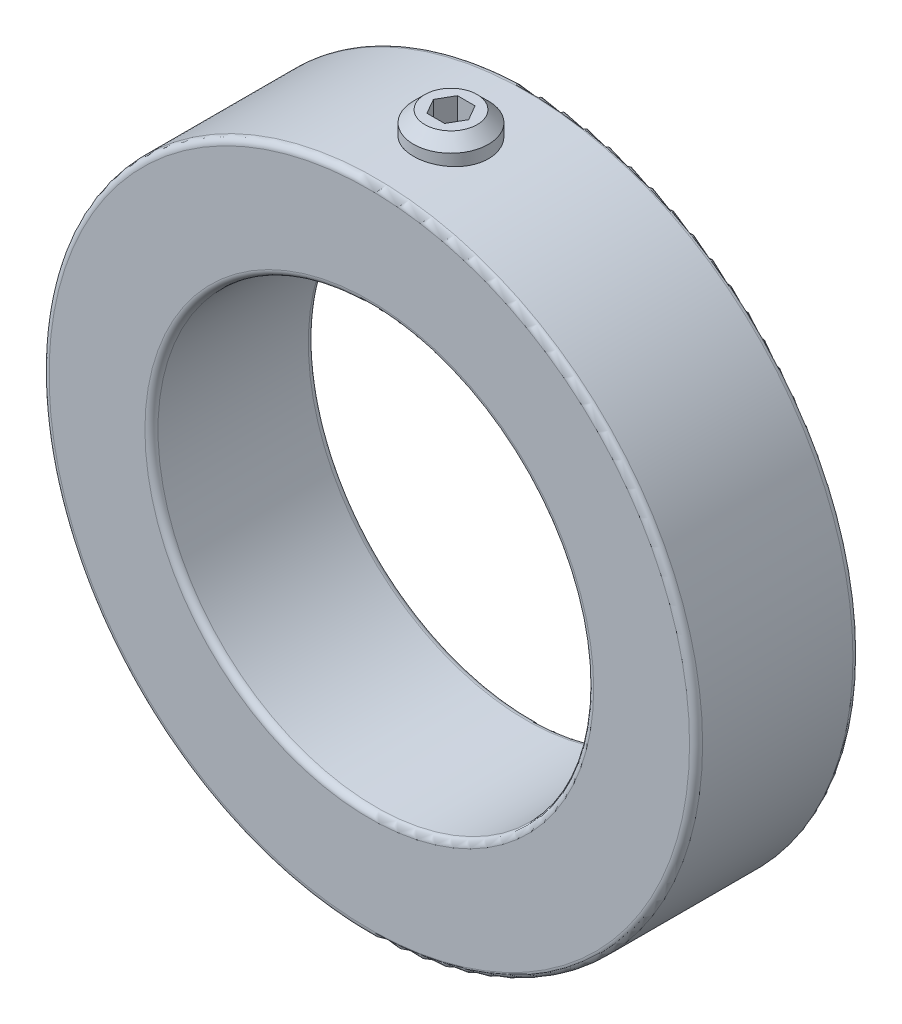
ISO-10303-21;
HEADER;
FILE_DESCRIPTION(('STEP AP214'),'2;1');
FILE_NAME('part.step','',(''),(''),'','','');
FILE_SCHEMA(('AUTOMOTIVE_DESIGN { 1 0 10303 214 1 1 1 1 }'));
ENDSEC;
DATA;
#1=APPLICATION_CONTEXT('core data for automotive mechanical design processes');
#2=APPLICATION_PROTOCOL_DEFINITION('international standard','automotive_design',2000,#1);
#3=PRODUCT_CONTEXT('',#1,'mechanical');
#4=PRODUCT('Part','Part','',(#3));
#5=PRODUCT_RELATED_PRODUCT_CATEGORY('part','',(#4));
#6=PRODUCT_DEFINITION_FORMATION('','',#4);
#7=PRODUCT_DEFINITION_CONTEXT('part definition',#1,'design');
#8=PRODUCT_DEFINITION('design','',#6,#7);
#9=PRODUCT_DEFINITION_SHAPE('','',#8);
#10=(LENGTH_UNIT() NAMED_UNIT(*) SI_UNIT(.MILLI.,.METRE.));
#11=(NAMED_UNIT(*) PLANE_ANGLE_UNIT() SI_UNIT($,.RADIAN.));
#12=(NAMED_UNIT(*) SI_UNIT($,.STERADIAN.) SOLID_ANGLE_UNIT());
#13=UNCERTAINTY_MEASURE_WITH_UNIT(LENGTH_MEASURE(1.E-05),#10,'distance_accuracy_value','');
#14=(GEOMETRIC_REPRESENTATION_CONTEXT(3) GLOBAL_UNCERTAINTY_ASSIGNED_CONTEXT((#13)) GLOBAL_UNIT_ASSIGNED_CONTEXT((#10,
#11,#12)) REPRESENTATION_CONTEXT('',''));
#15=CARTESIAN_POINT('',(0.,0.,0.));
#16=DIRECTION('',(0.,0.,1.));
#17=DIRECTION('',(1.,0.,0.));
#18=AXIS2_PLACEMENT_3D('',#15,#16,#17);
#19=CARTESIAN_POINT('',(0.,10.16,0.));
#20=DIRECTION('',(0.,1.,0.));
#21=DIRECTION('',(-1.,0.,0.));
#22=AXIS2_PLACEMENT_3D('',#19,#20,#21);
#23=PLANE('',#22);
#24=CARTESIAN_POINT('',(0.,10.16,0.));
#25=DIRECTION('',(0.,1.,0.));
#26=DIRECTION('',(-1.,0.,0.));
#27=AXIS2_PLACEMENT_3D('',#24,#25,#26);
#28=CIRCLE('',#27,0.761379651034046);
#29=CARTESIAN_POINT('',(-0.761379651034046,10.16,0.));
#30=VERTEX_POINT('',#29);
#31=EDGE_CURVE('E12',#30,#30,#28,.T.);
#32=ORIENTED_EDGE('',*,*,#31,.T.);
#33=EDGE_LOOP('',(#32));
#34=FACE_BOUND('',#33,.T.);
#35=DIRECTION('',(1.,0.,0.));
#36=VECTOR('',#35,1.);
#37=CARTESIAN_POINT('',(-0.256632194654789,10.16,-0.444499999999997));
#38=LINE('',#37,#36);
#39=CARTESIAN_POINT('',(-0.256632194654789,10.16,-0.444499999999997));
#40=VERTEX_POINT('',#39);
#41=CARTESIAN_POINT('',(0.256632194654789,10.16,-0.444499999999997));
#42=VERTEX_POINT('',#41);
#43=EDGE_CURVE('E115',#40,#42,#38,.T.);
#44=ORIENTED_EDGE('',*,*,#43,.T.);
#45=DIRECTION('',(0.5,0.,0.866025403784439));
#46=VECTOR('',#45,1.);
#47=CARTESIAN_POINT('',(0.256632194654789,10.16,-0.444499999999997));
#48=LINE('',#47,#46);
#49=CARTESIAN_POINT('',(0.513264389309577,10.16,0.));
#50=VERTEX_POINT('',#49);
#51=EDGE_CURVE('E61',#42,#50,#48,.T.);
#52=ORIENTED_EDGE('',*,*,#51,.T.);
#53=DIRECTION('',(-0.5,0.,0.866025403784439));
#54=VECTOR('',#53,1.);
#55=CARTESIAN_POINT('',(0.513264389309577,10.16,0.));
#56=LINE('',#55,#54);
#57=CARTESIAN_POINT('',(0.256632194654789,10.16,0.444500000000003));
#58=VERTEX_POINT('',#57);
#59=EDGE_CURVE('E119',#50,#58,#56,.T.);
#60=ORIENTED_EDGE('',*,*,#59,.T.);
#61=DIRECTION('',(-1.,0.,0.));
#62=VECTOR('',#61,1.);
#63=CARTESIAN_POINT('',(0.256632194654789,10.16,0.444500000000003));
#64=LINE('',#63,#62);
#65=CARTESIAN_POINT('',(-0.256632194654789,10.16,0.444500000000003));
#66=VERTEX_POINT('',#65);
#67=EDGE_CURVE('E182',#58,#66,#64,.T.);
#68=ORIENTED_EDGE('',*,*,#67,.T.);
#69=DIRECTION('',(-0.5,0.,-0.866025403784439));
#70=VECTOR('',#69,1.);
#71=CARTESIAN_POINT('',(-0.256632194654789,10.16,0.444500000000003));
#72=LINE('',#71,#70);
#73=CARTESIAN_POINT('',(-0.513264389309578,10.16,0.));
#74=VERTEX_POINT('',#73);
#75=EDGE_CURVE('E167',#66,#74,#72,.T.);
#76=ORIENTED_EDGE('',*,*,#75,.T.);
#77=DIRECTION('',(0.5,0.,-0.866025403784439));
#78=VECTOR('',#77,1.);
#79=CARTESIAN_POINT('',(-0.513264389309578,10.16,0.));
#80=LINE('',#79,#78);
#81=EDGE_CURVE('E163',#74,#40,#80,.T.);
#82=ORIENTED_EDGE('',*,*,#81,.T.);
#83=EDGE_LOOP('',(#44,#52,#60,#68,#76,#82));
#84=FACE_BOUND('',#83,.T.);
#85=ADVANCED_FACE('F47',(#34,#84),#23,.T.);
#86=CARTESIAN_POINT('',(0.,10.16,0.));
#87=DIRECTION('',(0.,-1.,0.));
#88=DIRECTION('',(1.,0.,0.));
#89=AXIS2_PLACEMENT_3D('',#86,#87,#88);
#90=CONICAL_SURFACE('',#89,0.761379651034046,0.785398163397447);
#91=CARTESIAN_POINT('',(0.,9.82917965103404,0.));
#92=DIRECTION('',(0.,1.,0.));
#93=DIRECTION('',(-1.,0.,0.));
#94=AXIS2_PLACEMENT_3D('',#91,#92,#93);
#95=CIRCLE('',#94,1.0922);
#96=CARTESIAN_POINT('',(-1.0922,9.82917965103404,0.));
#97=VERTEX_POINT('',#96);
#98=EDGE_CURVE('E54',#97,#97,#95,.T.);
#99=ORIENTED_EDGE('',*,*,#98,.T.);
#100=EDGE_LOOP('',(#99));
#101=FACE_BOUND('',#100,.T.);
#102=ORIENTED_EDGE('',*,*,#31,.F.);
#103=EDGE_LOOP('',(#102));
#104=FACE_BOUND('',#103,.T.);
#105=ADVANCED_FACE('F137',(#101,#104),#90,.T.);
#106=CARTESIAN_POINT('',(0.,6.35,0.));
#107=DIRECTION('',(0.,1.,0.));
#108=DIRECTION('',(-1.,0.,0.));
#109=AXIS2_PLACEMENT_3D('',#106,#107,#108);
#110=CYLINDRICAL_SURFACE('',#109,1.0922);
#111=CARTESIAN_POINT('',(0.,6.68082034896596,0.));
#112=DIRECTION('',(0.,1.,0.));
#113=DIRECTION('',(-1.,0.,0.));
#114=AXIS2_PLACEMENT_3D('',#111,#112,#113);
#115=CIRCLE('',#114,1.0922);
#116=CARTESIAN_POINT('',(-1.0922,6.68082034896596,0.));
#117=VERTEX_POINT('',#116);
#118=EDGE_CURVE('E132',#117,#117,#115,.T.);
#119=ORIENTED_EDGE('',*,*,#118,.T.);
#120=EDGE_LOOP('',(#119));
#121=FACE_BOUND('',#120,.T.);
#122=ORIENTED_EDGE('',*,*,#98,.F.);
#123=EDGE_LOOP('',(#122));
#124=FACE_BOUND('',#123,.T.);
#125=ADVANCED_FACE('F140',(#121,#124),#110,.T.);
#126=CARTESIAN_POINT('',(0.,6.68082034896596,0.));
#127=DIRECTION('',(0.,1.,0.));
#128=DIRECTION('',(-1.,0.,0.));
#129=AXIS2_PLACEMENT_3D('',#126,#127,#128);
#130=CONICAL_SURFACE('',#129,1.0922,0.785398163397448);
#131=CARTESIAN_POINT('',(0.,6.35,0.));
#132=DIRECTION('',(0.,1.,0.));
#133=DIRECTION('',(-1.,0.,0.));
#134=AXIS2_PLACEMENT_3D('',#131,#132,#133);
#135=CIRCLE('',#134,0.761379651034046);
#136=CARTESIAN_POINT('',(-0.761379651034046,6.35,0.));
#137=VERTEX_POINT('',#136);
#138=EDGE_CURVE('E124',#137,#137,#135,.T.);
#139=ORIENTED_EDGE('',*,*,#138,.T.);
#140=EDGE_LOOP('',(#139));
#141=FACE_BOUND('',#140,.T.);
#142=ORIENTED_EDGE('',*,*,#118,.F.);
#143=EDGE_LOOP('',(#142));
#144=FACE_BOUND('',#143,.T.);
#145=ADVANCED_FACE('F142',(#141,#144),#130,.T.);
#146=CARTESIAN_POINT('',(-0.761379651034046,6.35,0.));
#147=DIRECTION('',(0.,-1.,0.));
#148=DIRECTION('',(1.,0.,0.));
#149=AXIS2_PLACEMENT_3D('',#146,#147,#148);
#150=PLANE('',#149);
#151=CARTESIAN_POINT('',(0.,6.35,0.));
#152=DIRECTION('',(0.,1.,0.));
#153=DIRECTION('',(-1.,0.,0.));
#154=AXIS2_PLACEMENT_3D('',#151,#152,#153);
#155=CIRCLE('',#154,0.396984418759147);
#156=CARTESIAN_POINT('',(-0.396984418759147,6.35,0.));
#157=VERTEX_POINT('',#156);
#158=EDGE_CURVE('E120',#157,#157,#155,.T.);
#159=ORIENTED_EDGE('',*,*,#158,.T.);
#160=EDGE_LOOP('',(#159));
#161=FACE_BOUND('',#160,.T.);
#162=ORIENTED_EDGE('',*,*,#138,.F.);
#163=EDGE_LOOP('',(#162));
#164=FACE_BOUND('',#163,.T.);
#165=ADVANCED_FACE('F149',(#161,#164),#150,.T.);
#166=CARTESIAN_POINT('',(0.,6.35,0.));
#167=DIRECTION('',(0.,-1.,0.));
#168=DIRECTION('',(1.,0.,0.));
#169=AXIS2_PLACEMENT_3D('',#166,#167,#168);
#170=CONICAL_SURFACE('',#169,0.396984418759147,0.785398163397448);
#171=CARTESIAN_POINT('',(0.,6.74698441875915,0.));
#172=VERTEX_POINT('',#171);
#173=VERTEX_LOOP('',#172);
#174=FACE_BOUND('',#173,.T.);
#175=ORIENTED_EDGE('',*,*,#158,.F.);
#176=EDGE_LOOP('',(#175));
#177=FACE_BOUND('',#176,.T.);
#178=ADVANCED_FACE('F216',(#174,#177),#170,.F.);
#179=CARTESIAN_POINT('',(0.256632194654789,9.27099999999999,-0.444499999999997));
#180=DIRECTION('',(-0.866025403784439,0.,0.5));
#181=DIRECTION('',(0.5,0.,0.866025403784439));
#182=AXIS2_PLACEMENT_3D('',#179,#180,#181);
#183=PLANE('',#182);
#184=ORIENTED_EDGE('',*,*,#51,.F.);
#185=DIRECTION('',(0.,1.,0.));
#186=VECTOR('',#185,1.);
#187=CARTESIAN_POINT('',(0.256632194654789,9.27099999999999,-0.444499999999997));
#188=LINE('',#187,#186);
#189=CARTESIAN_POINT('',(0.256632194654789,9.27099999999999,-0.444499999999997));
#190=VERTEX_POINT('',#189);
#191=EDGE_CURVE('E114',#190,#42,#188,.T.);
#192=ORIENTED_EDGE('',*,*,#191,.F.);
#193=DIRECTION('',(0.5,0.,0.866025403784439));
#194=VECTOR('',#193,1.);
#195=CARTESIAN_POINT('',(0.256632194654789,9.27099999999999,-0.444499999999997));
#196=LINE('',#195,#194);
#197=CARTESIAN_POINT('',(0.513264389309577,9.27099999999999,0.));
#198=VERTEX_POINT('',#197);
#199=EDGE_CURVE('E105',#190,#198,#196,.T.);
#200=ORIENTED_EDGE('',*,*,#199,.T.);
#201=DIRECTION('',(0.,1.,0.));
#202=VECTOR('',#201,1.);
#203=CARTESIAN_POINT('',(0.513264389309577,9.27099999999999,0.));
#204=LINE('',#203,#202);
#205=EDGE_CURVE('E113',#198,#50,#204,.T.);
#206=ORIENTED_EDGE('',*,*,#205,.T.);
#207=EDGE_LOOP('',(#184,#192,#200,#206));
#208=FACE_BOUND('',#207,.T.);
#209=ADVANCED_FACE('F112',(#208),#183,.T.);
#210=CARTESIAN_POINT('',(0.513264389309577,9.27099999999999,0.));
#211=DIRECTION('',(-0.866025403784439,0.,-0.5));
#212=DIRECTION('',(-0.5,0.,0.866025403784439));
#213=AXIS2_PLACEMENT_3D('',#210,#211,#212);
#214=PLANE('',#213);
#215=ORIENTED_EDGE('',*,*,#59,.F.);
#216=ORIENTED_EDGE('',*,*,#205,.F.);
#217=DIRECTION('',(-0.5,0.,0.866025403784439));
#218=VECTOR('',#217,1.);
#219=CARTESIAN_POINT('',(0.513264389309577,9.27099999999999,0.));
#220=LINE('',#219,#218);
#221=CARTESIAN_POINT('',(0.256632194654789,9.27099999999999,0.444500000000003));
#222=VERTEX_POINT('',#221);
#223=EDGE_CURVE('E101',#198,#222,#220,.T.);
#224=ORIENTED_EDGE('',*,*,#223,.T.);
#225=DIRECTION('',(0.,1.,0.));
#226=VECTOR('',#225,1.);
#227=CARTESIAN_POINT('',(0.256632194654789,9.27099999999999,0.444500000000003));
#228=LINE('',#227,#226);
#229=EDGE_CURVE('E121',#222,#58,#228,.T.);
#230=ORIENTED_EDGE('',*,*,#229,.T.);
#231=EDGE_LOOP('',(#215,#216,#224,#230));
#232=FACE_BOUND('',#231,.T.);
#233=ADVANCED_FACE('F117',(#232),#214,.T.);
#234=CARTESIAN_POINT('',(0.256632194654789,9.27099999999999,0.444500000000003));
#235=DIRECTION('',(0.,0.,-1.));
#236=DIRECTION('',(-1.,0.,0.));
#237=AXIS2_PLACEMENT_3D('',#234,#235,#236);
#238=PLANE('',#237);
#239=ORIENTED_EDGE('',*,*,#67,.F.);
#240=ORIENTED_EDGE('',*,*,#229,.F.);
#241=DIRECTION('',(-1.,0.,0.));
#242=VECTOR('',#241,1.);
#243=CARTESIAN_POINT('',(0.256632194654789,9.27099999999999,0.444500000000003));
#244=LINE('',#243,#242);
#245=CARTESIAN_POINT('',(-0.256632194654789,9.27099999999999,0.444500000000003));
#246=VERTEX_POINT('',#245);
#247=EDGE_CURVE('E107',#222,#246,#244,.T.);
#248=ORIENTED_EDGE('',*,*,#247,.T.);
#249=DIRECTION('',(0.,1.,0.));
#250=VECTOR('',#249,1.);
#251=CARTESIAN_POINT('',(-0.256632194654789,9.27099999999999,0.444500000000003));
#252=LINE('',#251,#250);
#253=EDGE_CURVE('E126',#246,#66,#252,.T.);
#254=ORIENTED_EDGE('',*,*,#253,.T.);
#255=EDGE_LOOP('',(#239,#240,#248,#254));
#256=FACE_BOUND('',#255,.T.);
#257=ADVANCED_FACE('F180',(#256),#238,.T.);
#258=CARTESIAN_POINT('',(-0.256632194654789,9.27099999999999,0.444500000000003));
#259=DIRECTION('',(0.866025403784438,0.,-0.5));
#260=DIRECTION('',(-0.5,0.,-0.866025403784438));
#261=AXIS2_PLACEMENT_3D('',#258,#259,#260);
#262=PLANE('',#261);
#263=ORIENTED_EDGE('',*,*,#75,.F.);
#264=ORIENTED_EDGE('',*,*,#253,.F.);
#265=DIRECTION('',(-0.5,0.,-0.866025403784439));
#266=VECTOR('',#265,1.);
#267=CARTESIAN_POINT('',(-0.256632194654789,9.27099999999999,0.444500000000003));
#268=LINE('',#267,#266);
#269=CARTESIAN_POINT('',(-0.513264389309578,9.27099999999999,0.));
#270=VERTEX_POINT('',#269);
#271=EDGE_CURVE('E193',#246,#270,#268,.T.);
#272=ORIENTED_EDGE('',*,*,#271,.T.);
#273=DIRECTION('',(0.,1.,0.));
#274=VECTOR('',#273,1.);
#275=CARTESIAN_POINT('',(-0.513264389309578,9.27099999999999,0.));
#276=LINE('',#275,#274);
#277=EDGE_CURVE('E175',#270,#74,#276,.T.);
#278=ORIENTED_EDGE('',*,*,#277,.T.);
#279=EDGE_LOOP('',(#263,#264,#272,#278));
#280=FACE_BOUND('',#279,.T.);
#281=ADVANCED_FACE('F184',(#280),#262,.T.);
#282=CARTESIAN_POINT('',(-0.513264389309578,9.27099999999999,0.));
#283=DIRECTION('',(0.866025403784439,0.,0.5));
#284=DIRECTION('',(0.5,0.,-0.866025403784439));
#285=AXIS2_PLACEMENT_3D('',#282,#283,#284);
#286=PLANE('',#285);
#287=ORIENTED_EDGE('',*,*,#81,.F.);
#288=ORIENTED_EDGE('',*,*,#277,.F.);
#289=DIRECTION('',(0.5,0.,-0.866025403784439));
#290=VECTOR('',#289,1.);
#291=CARTESIAN_POINT('',(-0.513264389309578,9.27099999999999,0.));
#292=LINE('',#291,#290);
#293=CARTESIAN_POINT('',(-0.256632194654789,9.27099999999999,-0.444499999999997));
#294=VERTEX_POINT('',#293);
#295=EDGE_CURVE('E191',#270,#294,#292,.T.);
#296=ORIENTED_EDGE('',*,*,#295,.T.);
#297=DIRECTION('',(0.,1.,0.));
#298=VECTOR('',#297,1.);
#299=CARTESIAN_POINT('',(-0.256632194654789,9.27099999999999,-0.444499999999997));
#300=LINE('',#299,#298);
#301=EDGE_CURVE('E172',#294,#40,#300,.T.);
#302=ORIENTED_EDGE('',*,*,#301,.T.);
#303=EDGE_LOOP('',(#287,#288,#296,#302));
#304=FACE_BOUND('',#303,.T.);
#305=ADVANCED_FACE('F197',(#304),#286,.T.);
#306=CARTESIAN_POINT('',(-0.256632194654789,9.27099999999999,-0.444499999999997));
#307=DIRECTION('',(0.,0.,1.));
#308=DIRECTION('',(1.,0.,0.));
#309=AXIS2_PLACEMENT_3D('',#306,#307,#308);
#310=PLANE('',#309);
#311=ORIENTED_EDGE('',*,*,#43,.F.);
#312=ORIENTED_EDGE('',*,*,#301,.F.);
#313=DIRECTION('',(1.,0.,0.));
#314=VECTOR('',#313,1.);
#315=CARTESIAN_POINT('',(-0.256632194654789,9.27099999999999,-0.444499999999997));
#316=LINE('',#315,#314);
#317=EDGE_CURVE('E173',#294,#190,#316,.T.);
#318=ORIENTED_EDGE('',*,*,#317,.T.);
#319=ORIENTED_EDGE('',*,*,#191,.T.);
#320=EDGE_LOOP('',(#311,#312,#318,#319));
#321=FACE_BOUND('',#320,.T.);
#322=ADVANCED_FACE('F198',(#321),#310,.T.);
#323=CARTESIAN_POINT('',(0.769896583964366,9.27099999999999,0.444500000000003));
#324=DIRECTION('',(0.,-1.,0.));
#325=DIRECTION('',(0.,0.,-1.));
#326=AXIS2_PLACEMENT_3D('',#323,#324,#325);
#327=PLANE('',#326);
#328=ORIENTED_EDGE('',*,*,#199,.F.);
#329=ORIENTED_EDGE('',*,*,#317,.F.);
#330=ORIENTED_EDGE('',*,*,#295,.F.);
#331=ORIENTED_EDGE('',*,*,#271,.F.);
#332=ORIENTED_EDGE('',*,*,#247,.F.);
#333=ORIENTED_EDGE('',*,*,#223,.F.);
#334=EDGE_LOOP('',(#328,#329,#330,#331,#332,#333));
#335=FACE_BOUND('',#334,.T.);
#336=ADVANCED_FACE('F103',(#335),#327,.F.);
#337=CLOSED_SHELL('',(#85,#105,#125,#145,#165,#178,#209,#233,#257,#281,#305,#322,#336));
#338=MANIFOLD_SOLID_BREP('B2',#337);
#339=CARTESIAN_POINT('',(0.,0.,2.38125));
#340=DIRECTION('',(0.,0.,1.));
#341=DIRECTION('',(1.,0.,0.));
#342=AXIS2_PLACEMENT_3D('',#339,#340,#341);
#343=PLANE('',#342);
#344=CARTESIAN_POINT('',(0.,0.,2.38125));
#345=DIRECTION('',(0.,0.,1.));
#346=DIRECTION('',(1.,0.,0.));
#347=AXIS2_PLACEMENT_3D('',#344,#345,#346);
#348=CIRCLE('',#347,6.5405);
#349=CARTESIAN_POINT('',(6.5405,0.,2.38125));
#350=VERTEX_POINT('',#349);
#351=EDGE_CURVE('E313',#350,#350,#348,.F.);
#352=ORIENTED_EDGE('',*,*,#351,.T.);
#353=EDGE_LOOP('',(#352));
#354=FACE_BOUND('',#353,.T.);
#355=CARTESIAN_POINT('',(0.,0.,2.38125));
#356=DIRECTION('',(0.,0.,1.));
#357=DIRECTION('',(1.,0.,0.));
#358=AXIS2_PLACEMENT_3D('',#355,#356,#357);
#359=CIRCLE('',#358,9.3345);
#360=CARTESIAN_POINT('',(9.3345,0.,2.38125));
#361=VERTEX_POINT('',#360);
#362=EDGE_CURVE('E317',#361,#361,#359,.T.);
#363=ORIENTED_EDGE('',*,*,#362,.T.);
#364=EDGE_LOOP('',(#363));
#365=FACE_BOUND('',#364,.T.);
#366=ADVANCED_FACE('F302',(#354,#365),#343,.T.);
#367=CARTESIAN_POINT('',(0.,0.,-2.38125));
#368=DIRECTION('',(0.,0.,1.));
#369=DIRECTION('',(1.,0.,0.));
#370=AXIS2_PLACEMENT_3D('',#367,#368,#369);
#371=PLANE('',#370);
#372=CARTESIAN_POINT('',(0.,0.,-2.38125));
#373=DIRECTION('',(0.,0.,1.));
#374=DIRECTION('',(1.,0.,0.));
#375=AXIS2_PLACEMENT_3D('',#372,#373,#374);
#376=CIRCLE('',#375,6.5405);
#377=CARTESIAN_POINT('',(6.5405,0.,-2.38125));
#378=VERTEX_POINT('',#377);
#379=EDGE_CURVE('E328',#378,#378,#376,.T.);
#380=ORIENTED_EDGE('',*,*,#379,.T.);
#381=EDGE_LOOP('',(#380));
#382=FACE_BOUND('',#381,.T.);
#383=CARTESIAN_POINT('',(0.,0.,-2.38125));
#384=DIRECTION('',(0.,0.,1.));
#385=DIRECTION('',(1.,0.,0.));
#386=AXIS2_PLACEMENT_3D('',#383,#384,#385);
#387=CIRCLE('',#386,9.3345);
#388=CARTESIAN_POINT('',(9.3345,0.,-2.38125));
#389=VERTEX_POINT('',#388);
#390=EDGE_CURVE('E331',#389,#389,#387,.F.);
#391=ORIENTED_EDGE('',*,*,#390,.T.);
#392=EDGE_LOOP('',(#391));
#393=FACE_BOUND('',#392,.T.);
#394=ADVANCED_FACE('F367',(#382,#393),#371,.F.);
#395=CARTESIAN_POINT('',(0.,0.,2.38125));
#396=DIRECTION('',(0.,0.,-1.));
#397=DIRECTION('',(-1.,0.,0.));
#398=AXIS2_PLACEMENT_3D('',#395,#396,#397);
#399=CYLINDRICAL_SURFACE('',#398,9.525);
#400=CARTESIAN_POINT('',(0.,0.,-2.19075));
#401=DIRECTION('',(0.,0.,1.));
#402=DIRECTION('',(1.,0.,0.));
#403=AXIS2_PLACEMENT_3D('',#400,#401,#402);
#404=CIRCLE('',#403,9.525);
#405=CARTESIAN_POINT('',(9.525,0.,-2.19075));
#406=VERTEX_POINT('',#405);
#407=EDGE_CURVE('E46',#406,#406,#404,.T.);
#408=ORIENTED_EDGE('',*,*,#407,.T.);
#409=EDGE_LOOP('',(#408));
#410=FACE_BOUND('',#409,.T.);
#411=CARTESIAN_POINT('',(0.,0.,2.19075));
#412=DIRECTION('',(0.,0.,1.));
#413=DIRECTION('',(1.,0.,0.));
#414=AXIS2_PLACEMENT_3D('',#411,#412,#413);
#415=CIRCLE('',#414,9.525);
#416=CARTESIAN_POINT('',(9.525,0.,2.19075));
#417=VERTEX_POINT('',#416);
#418=EDGE_CURVE('E309',#417,#417,#415,.F.);
#419=ORIENTED_EDGE('',*,*,#418,.T.);
#420=EDGE_LOOP('',(#419));
#421=FACE_BOUND('',#420,.T.);
#422=CARTESIAN_POINT('',(0.,9.525,-1.0922));
#423=CARTESIAN_POINT('',(0.0611340816034868,9.52499920650019,-1.09219737941527));
#424=CARTESIAN_POINT('',(0.122307342263932,9.52440520411528,-1.08704988631206));
#425=CARTESIAN_POINT('',(0.242954383871701,9.52209273889947,-1.06659521998619));
#426=CARTESIAN_POINT('',(0.302426276176674,9.52037307347669,-1.05127718090209));
#427=CARTESIAN_POINT('',(0.41790628856615,9.51600318348536,-1.01093628027684));
#428=CARTESIAN_POINT('',(0.473916608436215,9.51335355719767,-0.98591965714131));
#429=CARTESIAN_POINT('',(0.58093233471812,9.50741913230406,-0.926904711943348));
#430=CARTESIAN_POINT('',(0.631938657196184,9.50413445028412,-0.892908038054393));
#431=CARTESIAN_POINT('',(0.727747943898577,9.49728003441084,-0.816728113145141));
#432=CARTESIAN_POINT('',(0.772524210440001,9.49370917123463,-0.774511383543346));
#433=CARTESIAN_POINT('',(0.854372609789328,9.48669405789876,-0.683161452297193));
#434=CARTESIAN_POINT('',(0.891444366438359,9.48324981392783,-0.634027913148369));
#435=CARTESIAN_POINT('',(0.956928903772448,9.47686664894398,-0.530068149203758));
#436=CARTESIAN_POINT('',(0.985317017234139,9.47392917761591,-0.475226289795223));
#437=CARTESIAN_POINT('',(1.0324709216248,9.46890671985253,-0.361514526595955));
#438=CARTESIAN_POINT('',(1.05123702108338,9.46682170608362,-0.302644752028826));
#439=CARTESIAN_POINT('',(1.07853385810512,9.46375081532633,-0.182823512670579));
#440=CARTESIAN_POINT('',(1.08710936897964,9.46276013165885,-0.121882373123946));
#441=CARTESIAN_POINT('',(1.09392008437988,9.46197528343695,0.000581575127577778));
#442=CARTESIAN_POINT('',(1.09215564115591,9.46218107812222,0.0621043639461859));
#443=CARTESIAN_POINT('',(1.07837335162616,9.46376153791637,0.183674673628932));
#444=CARTESIAN_POINT('',(1.06640463284257,9.46513060246511,0.243727847132729));
#445=CARTESIAN_POINT('',(1.03263009911351,9.4688746050893,0.360967575413978));
#446=CARTESIAN_POINT('',(1.01082411389427,9.47124956057572,0.418154080553074));
#447=CARTESIAN_POINT('',(0.957940610435931,9.47674414449591,0.52819090996247));
#448=CARTESIAN_POINT('',(0.926841547062815,9.47986549999187,0.581030789928711));
#449=CARTESIAN_POINT('',(0.85627011711868,9.48649980271767,0.680760061632417));
#450=CARTESIAN_POINT('',(0.816797428103499,9.49001276502469,0.727649224113764));
#451=CARTESIAN_POINT('',(0.730326030775964,9.4970593898461,0.81443134665226));
#452=CARTESIAN_POINT('',(0.683284940487081,9.50059305407823,0.854282088517053));
#453=CARTESIAN_POINT('',(0.583158533932715,9.50726376692366,0.925528094086652));
#454=CARTESIAN_POINT('',(0.530073207223121,9.51040081485159,0.956923343180515));
#455=CARTESIAN_POINT('',(0.41933412196472,9.51592635887285,1.01036643807534));
#456=CARTESIAN_POINT('',(0.361679183929212,9.51831466090991,1.03241186115602));
#457=CARTESIAN_POINT('',(0.243452522104104,9.52207177474507,1.066497136009));
#458=CARTESIAN_POINT('',(0.182880913217744,9.52344062666983,1.07853738159807));
#459=CARTESIAN_POINT('',(0.0609056033257837,9.52499942128186,1.0922163154717));
#460=CARTESIAN_POINT('',(-0.000491489782575844,9.52519596036488,1.09391320516551));
#461=CARTESIAN_POINT('',(-0.122695410422124,9.52440574118332,1.08701053206646));
#462=CARTESIAN_POINT('',(-0.183502248472625,9.52341900404583,1.07841115311085));
#463=CARTESIAN_POINT('',(-0.302629491029879,9.5203772547371,1.05120837129571));
#464=CARTESIAN_POINT('',(-0.360956263858785,9.51832518303599,1.03263250008297));
#465=CARTESIAN_POINT('',(-0.473666361810123,9.51338270337485,0.98603251242848));
#466=CARTESIAN_POINT('',(-0.528049572609031,9.51049227112295,0.958008122207928));
#467=CARTESIAN_POINT('',(-0.631590158720432,9.50417932157245,0.893164242710671));
#468=CARTESIAN_POINT('',(-0.680723652313032,9.50075453370327,0.856306844629787));
#469=CARTESIAN_POINT('',(-0.772127651893545,9.49376370420186,0.774897142577451));
#470=CARTESIAN_POINT('',(-0.814397929862664,9.49019765788145,0.73034458304865));
#471=CARTESIAN_POINT('',(-0.891080164205073,9.48330609195812,0.634553916313913));
#472=CARTESIAN_POINT('',(-0.925453706043072,9.47998179976109,0.583284956563936));
#473=CARTESIAN_POINT('',(-0.985101923572045,9.47396969300795,0.475667613739886));
#474=CARTESIAN_POINT('',(-1.010376756775,9.47128186743395,0.419319318617669));
#475=CARTESIAN_POINT('',(-1.05104696871845,9.46685511096879,0.303270194075392));
#476=CARTESIAN_POINT('',(-1.06646453138282,9.46511405069968,0.243577223813026));
#477=CARTESIAN_POINT('',(-1.08705424308227,9.46277164462833,0.122428579489618));
#478=CARTESIAN_POINT('',(-1.09222678760424,9.4621702548316,0.0609729735642479));
#479=CARTESIAN_POINT('',(-1.09217315834302,9.46217641498708,-0.0615744524015152));
#480=CARTESIAN_POINT('',(-1.08700732882789,9.46277694940441,-0.12266630806314));
#481=CARTESIAN_POINT('',(-1.06655082224395,9.46510426577693,-0.243107734144009));
#482=CARTESIAN_POINT('',(-1.05126013911003,9.46683104840679,-0.302457303519547));
#483=CARTESIAN_POINT('',(-1.01100588973634,9.47121422632462,-0.417724747346851));
#484=CARTESIAN_POINT('',(-0.986044740269203,9.47387038933254,-0.473643475168225));
#485=CARTESIAN_POINT('',(-0.927164122011531,9.47981347040499,-0.58050794151391));
#486=CARTESIAN_POINT('',(-0.893244611818384,9.48310039138465,-0.631453657053095));
#487=CARTESIAN_POINT('',(-0.817184848425817,9.48995763997495,-0.727234879509119));
#488=CARTESIAN_POINT('',(-0.774999583899802,9.49352945280765,-0.772034538468959));
#489=CARTESIAN_POINT('',(-0.683698242322391,9.50054069157453,-0.853943324773295));
#490=CARTESIAN_POINT('',(-0.634580522830455,9.50398008588956,-0.891050624482121));
#491=CARTESIAN_POINT('',(-0.53062979453241,9.51035095496463,-0.956620429574818));
#492=CARTESIAN_POINT('',(-0.47577886343878,9.51328075578122,-0.985054667361781));
#493=CARTESIAN_POINT('',(-0.362079729009758,9.51828494463816,-1.03226939004486));
#494=CARTESIAN_POINT('',(-0.303236023157979,9.52036027711967,-1.05106053910993));
#495=CARTESIAN_POINT('',(-0.203395712675832,9.52291204123106,-1.07387465846493));
#496=CARTESIAN_POINT('',(-0.163032720345742,9.52369128364714,-1.08073700174133));
#497=CARTESIAN_POINT('',(-0.081785662478084,9.5247355269715,-1.08990053581114));
#498=CARTESIAN_POINT('',(-0.0409015999911375,9.525000530889,-1.09220175329547));
#499=CARTESIAN_POINT('',(0.,9.525,-1.0922));
#500=B_SPLINE_CURVE_WITH_KNOTS('',3,(#422,#423,#424,#425,#426,#427,#428,#429,#430,#431,#432,
#433,#434,#435,#436,#437,#438,#439,#440,#441,#442,#443,#444,#445,#446,#447,#448,#449,#450,#451,
#452,#453,#454,#455,#456,#457,#458,#459,#460,#461,#462,#463,#464,#465,#466,#467,#468,#469,#470,
#471,#472,#473,#474,#475,#476,#477,#478,#479,#480,#481,#482,#483,#484,#485,#486,#487,#488,#489,
#490,#491,#492,#493,#494,#495,#496,#497,#498,#499),.UNSPECIFIED.,.T.,.F.,(4,2,2,2,2,2,2,2,2,2,2,
2,2,2,2,2,2,2,2,2,2,2,2,2,2,2,2,2,2,2,2,2,2,2,2,2,2,2,4),(0.,0.183252863628537,
0.366701824019404,0.550032980068568,0.733330511380135,0.917390809810197,1.10146009254408,
1.28604749795006,1.47062898419581,1.65439646003133,1.83815767551282,2.02103915361322,
2.20392379734052,2.38723577579021,2.57055481433695,2.75493863167841,2.93932276762983,
3.12375465192078,3.30817927638979,3.49156518996853,3.67494782928718,3.85782697735642,
4.04071142495868,4.22439527866575,4.40808523371169,4.59265069100454,4.77721295304526,
4.96135837935749,5.14549669699311,5.3285633486061,5.51163010988193,5.69465114992557,
5.87767303584734,6.06172075192847,6.24581214610753,6.43049728053898,6.61497773149377,
6.73758330584053,6.86018816271855),.UNSPECIFIED.);
#501=CARTESIAN_POINT('',(0.,9.525,-1.0922));
#502=VERTEX_POINT('',#501);
#503=EDGE_CURVE('E334',#502,#502,#500,.T.);
#504=ORIENTED_EDGE('',*,*,#503,.T.);
#505=EDGE_LOOP('',(#504));
#506=FACE_BOUND('',#505,.T.);
#507=ADVANCED_FACE('F363',(#410,#421,#506),#399,.T.);
#508=CARTESIAN_POINT('',(0.,0.,2.38125));
#509=DIRECTION('',(0.,0.,-1.));
#510=DIRECTION('',(-1.,0.,0.));
#511=AXIS2_PLACEMENT_3D('',#508,#509,#510);
#512=CYLINDRICAL_SURFACE('',#511,6.35);
#513=CARTESIAN_POINT('',(0.,0.,-2.19075));
#514=DIRECTION('',(0.,0.,1.));
#515=DIRECTION('',(1.,0.,0.));
#516=AXIS2_PLACEMENT_3D('',#513,#514,#515);
#517=CIRCLE('',#516,6.35);
#518=CARTESIAN_POINT('',(6.35,0.,-2.19075));
#519=VERTEX_POINT('',#518);
#520=EDGE_CURVE('E322',#519,#519,#517,.F.);
#521=ORIENTED_EDGE('',*,*,#520,.T.);
#522=EDGE_LOOP('',(#521));
#523=FACE_BOUND('',#522,.T.);
#524=CARTESIAN_POINT('',(0.,0.,2.19075));
#525=DIRECTION('',(0.,0.,1.));
#526=DIRECTION('',(1.,0.,0.));
#527=AXIS2_PLACEMENT_3D('',#524,#525,#526);
#528=CIRCLE('',#527,6.35);
#529=CARTESIAN_POINT('',(6.35,0.,2.19075));
#530=VERTEX_POINT('',#529);
#531=EDGE_CURVE('E325',#530,#530,#528,.T.);
#532=ORIENTED_EDGE('',*,*,#531,.T.);
#533=EDGE_LOOP('',(#532));
#534=FACE_BOUND('',#533,.T.);
#535=CARTESIAN_POINT('',(0.,6.35,-1.0922));
#536=CARTESIAN_POINT('',(0.0608680205287796,6.34999893901372,-1.09219758563499));
#537=CARTESIAN_POINT('',(0.121768538027935,6.34911572638414,-1.08709457122708));
#538=CARTESIAN_POINT('',(0.241859521691323,6.34567748385816,-1.06682696946527));
#539=CARTESIAN_POINT('',(0.301048396837986,6.34312094761676,-1.05165331623501));
#540=CARTESIAN_POINT('',(0.415961421035542,6.33662261925285,-1.01171778107917));
#541=CARTESIAN_POINT('',(0.471688431689926,6.33268198965781,-0.986963943968035));
#542=CARTESIAN_POINT('',(0.578191527288218,6.32384802733249,-0.928592223721529));
#543=CARTESIAN_POINT('',(0.628968136738547,6.31895479569759,-0.894975281053742));
#544=CARTESIAN_POINT('',(0.724651298457644,6.30870194176172,-0.819468676768367));
#545=CARTESIAN_POINT('',(0.769500292382833,6.30333848406862,-0.777506589385808));
#546=CARTESIAN_POINT('',(0.851557745664279,6.29277880819444,-0.686656720263172));
#547=CARTESIAN_POINT('',(0.888765707072786,6.28758260093128,-0.63776848751343));
#548=CARTESIAN_POINT('',(0.954717729166265,6.27790859209413,-0.534055874716745));
#549=CARTESIAN_POINT('',(0.98340446864741,6.27343574416785,-0.479194541003037));
#550=CARTESIAN_POINT('',(1.03113308277445,6.26576831585163,-0.365341908188951));
#551=CARTESIAN_POINT('',(1.05017565257628,6.26257364333373,-0.306350907105773));
#552=CARTESIAN_POINT('',(1.07789318926024,6.2578625704701,-0.18652507205154));
#553=CARTESIAN_POINT('',(1.08666778231185,6.25633005371632,-0.125713928879639));
#554=CARTESIAN_POINT('',(1.09390926363973,6.25506809986237,-0.00346465584794825));
#555=CARTESIAN_POINT('',(1.09237692882782,6.25533852686056,0.0579734264060916));
#556=CARTESIAN_POINT('',(1.07912911054579,6.25763720095215,0.179018814541457));
#557=CARTESIAN_POINT('',(1.06752587607449,6.25964607085226,0.238638827249168));
#558=CARTESIAN_POINT('',(1.03464194045348,6.26516492481944,0.355073082000201));
#559=CARTESIAN_POINT('',(1.01336088777098,6.26867496341403,0.411887222041132));
#560=CARTESIAN_POINT('',(0.961612596174463,6.27682142850598,0.521431156309471));
#561=CARTESIAN_POINT('',(0.931099062440618,6.28146350813845,0.574138643266521));
#562=CARTESIAN_POINT('',(0.861784812638385,6.29134713277073,0.67372784422149));
#563=CARTESIAN_POINT('',(0.822983385277329,6.29658872920498,0.72060905764398));
#564=CARTESIAN_POINT('',(0.737584755464339,6.30716576235449,0.80786438674779));
#565=CARTESIAN_POINT('',(0.690891316426382,6.31250152385221,0.848144333638802));
#566=CARTESIAN_POINT('',(0.591358745090205,6.32260175158515,0.920312094928664));
#567=CARTESIAN_POINT('',(0.538519568271439,6.32736621368129,0.952199848527884));
#568=CARTESIAN_POINT('',(0.42810451772508,6.33579444517632,1.00668790701237));
#569=CARTESIAN_POINT('',(0.370524277103179,6.33945718502405,1.02927953194411));
#570=CARTESIAN_POINT('',(0.252309592589021,6.34526110006101,1.06444474094977));
#571=CARTESIAN_POINT('',(0.191675421542212,6.34740241092103,1.07701921829754));
#572=CARTESIAN_POINT('',(0.0698853386261755,6.34990386096245,1.09166469531094));
#573=CARTESIAN_POINT('',(0.00874539934722772,6.35028591048196,1.0938649073352));
#574=CARTESIAN_POINT('',(-0.113029290240457,6.34928592758098,1.08804440107384));
#575=CARTESIAN_POINT('',(-0.173664061194365,6.34790396761134,1.08002410256194));
#576=CARTESIAN_POINT('',(-0.292305469495329,6.34354482718939,1.05409770860789));
#577=CARTESIAN_POINT('',(-0.350326576404338,6.34057802895712,1.0362559304042));
#578=CARTESIAN_POINT('',(-0.462554090609897,6.33338050901466,0.991261857745361));
#579=CARTESIAN_POINT('',(-0.516760272045295,6.32914971254761,0.964109012590109));
#580=CARTESIAN_POINT('',(-0.620378080657299,6.31983904804962,0.900970086888833));
#581=CARTESIAN_POINT('',(-0.669740093948827,6.31475160497409,0.864903723484998));
#582=CARTESIAN_POINT('',(-0.761757365690011,6.30431393194375,0.785071543945457));
#583=CARTESIAN_POINT('',(-0.804412102742451,6.29896368160172,0.741305129797949));
#584=CARTESIAN_POINT('',(-0.882285942455411,6.28853209718844,0.646734317883641));
#585=CARTESIAN_POINT('',(-0.917417520778748,6.28345439496099,0.595857384038029));
#586=CARTESIAN_POINT('',(-0.978635518308475,6.27421190401564,0.488848213346108));
#587=CARTESIAN_POINT('',(-1.00472223742281,6.2700470850302,0.432716150826882));
#588=CARTESIAN_POINT('',(-1.04698076315175,6.26312947872918,0.317029294305599));
#589=CARTESIAN_POINT('',(-1.06319528654795,6.26037061644734,0.257490483862742));
#590=CARTESIAN_POINT('',(-1.08538296797456,6.25656237425924,0.136482667934264));
#591=CARTESIAN_POINT('',(-1.09135708026274,6.2555128350693,0.0750138428416629));
#592=CARTESIAN_POINT('',(-1.09286642645734,6.25524923949712,-0.0472345090054634));
#593=CARTESIAN_POINT('',(-1.08853949259515,6.25601094771905,-0.10801232543007));
#594=CARTESIAN_POINT('',(-1.06986852378756,6.25923075360908,-0.227961177716687));
#595=CARTESIAN_POINT('',(-1.05552452754524,6.26168884472285,-0.287132219785897));
#596=CARTESIAN_POINT('',(-1.01728075041861,6.26801499409114,-0.402129446609844));
#597=CARTESIAN_POINT('',(-0.993393590990873,6.27188118944143,-0.457959937768897));
#598=CARTESIAN_POINT('',(-0.936755917793813,6.28058959834008,-0.564843187863846));
#599=CARTESIAN_POINT('',(-0.904004917829632,6.28543186542371,-0.615895684512833));
#600=CARTESIAN_POINT('',(-0.830080436097702,6.29562326150501,-0.712468695981408));
#601=CARTESIAN_POINT('',(-0.788805810553335,6.30097801934876,-0.757911205167378));
#602=CARTESIAN_POINT('',(-0.699218499192292,6.31154685284407,-0.841272028132837));
#603=CARTESIAN_POINT('',(-0.65090419408273,6.31676089579994,-0.879188606016983));
#604=CARTESIAN_POINT('',(-0.548182774598067,6.32650571336956,-0.946679412041825));
#605=CARTESIAN_POINT('',(-0.493733193924913,6.33103114271282,-0.976189788757056));
#606=CARTESIAN_POINT('',(-0.380592624153773,6.33883682779988,-1.02559884523328));
#607=CARTESIAN_POINT('',(-0.321905866314021,6.34211830583166,-1.04550696529578));
#608=CARTESIAN_POINT('',(-0.219170041529574,6.34636170655063,-1.07089312338762));
#609=CARTESIAN_POINT('',(-0.175737669558253,6.34771867407019,-1.07887019885419));
#610=CARTESIAN_POINT('',(-0.0882092128492718,6.34953819673961,-1.08952446155034));
#611=CARTESIAN_POINT('',(-0.0441131407752665,6.35000076893312,-1.09220174977307));
#612=CARTESIAN_POINT('',(0.,6.35,-1.0922));
#613=B_SPLINE_CURVE_WITH_KNOTS('',3,(#535,#536,#537,#538,#539,#540,#541,#542,#543,#544,#545,
#546,#547,#548,#549,#550,#551,#552,#553,#554,#555,#556,#557,#558,#559,#560,#561,#562,#563,#564,
#565,#566,#567,#568,#569,#570,#571,#572,#573,#574,#575,#576,#577,#578,#579,#580,#581,#582,#583,
#584,#585,#586,#587,#588,#589,#590,#591,#592,#593,#594,#595,#596,#597,#598,#599,#600,#601,#602,
#603,#604,#605,#606,#607,#608,#609,#610,#611,#612),.UNSPECIFIED.,.T.,.F.,(4,2,2,2,2,2,2,2,2,2,2,
2,2,2,2,2,2,2,2,2,2,2,2,2,2,2,2,2,2,2,2,2,2,2,2,2,2,2,4),(0.,0.182442796494119,
0.365050056377567,0.547504306132413,0.72993920338214,0.914032539901149,1.09813786953671,
1.28345497755317,1.46875872593015,1.65224923209448,1.83572590733391,2.01718346007229,
2.19864760452119,2.38103719163032,2.56344243827194,2.74825794266902,2.93307478597769,
3.11806380646882,3.30303632881438,3.48569880681676,3.66835378280286,3.84982660817388,
4.03131016854912,4.21449203626523,4.39768813678552,4.58291188462231,4.76812949025324,
4.95253985950968,5.13693304346049,5.31887286695205,5.50081198748391,5.68251127403916,
5.8642205290917,6.04822458469577,6.23227103260143,6.41768028672224,6.60290688533041,
6.73513195303153,6.86735450101751),.UNSPECIFIED.);
#614=CARTESIAN_POINT('',(0.,6.35,-1.0922));
#615=VERTEX_POINT('',#614);
#616=EDGE_CURVE('E335',#615,#615,#613,.T.);
#617=ORIENTED_EDGE('',*,*,#616,.F.);
#618=EDGE_LOOP('',(#617));
#619=FACE_BOUND('',#618,.T.);
#620=ADVANCED_FACE('F347',(#523,#534,#619),#512,.F.);
#621=CARTESIAN_POINT('',(0.,9.525,0.));
#622=DIRECTION('',(0.,-1.,0.));
#623=DIRECTION('',(0.,0.,-1.));
#624=AXIS2_PLACEMENT_3D('',#621,#622,#623);
#625=CYLINDRICAL_SURFACE('',#624,1.0922);
#626=ORIENTED_EDGE('',*,*,#616,.T.);
#627=EDGE_LOOP('',(#626));
#628=FACE_BOUND('',#627,.T.);
#629=ORIENTED_EDGE('',*,*,#503,.F.);
#630=EDGE_LOOP('',(#629));
#631=FACE_BOUND('',#630,.T.);
#632=ADVANCED_FACE('F350',(#628,#631),#625,.F.);
#633=CARTESIAN_POINT('',(0.,0.,-2.19075));
#634=DIRECTION('',(0.,0.,1.));
#635=DIRECTION('',(1.,0.,0.));
#636=AXIS2_PLACEMENT_3D('',#633,#634,#635);
#637=TOROIDAL_SURFACE('',#636,6.5405,0.1905);
#638=ORIENTED_EDGE('',*,*,#520,.F.);
#639=EDGE_LOOP('',(#638));
#640=FACE_BOUND('',#639,.T.);
#641=ORIENTED_EDGE('',*,*,#379,.F.);
#642=EDGE_LOOP('',(#641));
#643=FACE_BOUND('',#642,.T.);
#644=ADVANCED_FACE('F353',(#640,#643),#637,.T.);
#645=CARTESIAN_POINT('',(0.,0.,2.19075));
#646=DIRECTION('',(0.,0.,1.));
#647=DIRECTION('',(1.,0.,0.));
#648=AXIS2_PLACEMENT_3D('',#645,#646,#647);
#649=TOROIDAL_SURFACE('',#648,6.5405,0.1905);
#650=ORIENTED_EDGE('',*,*,#351,.F.);
#651=EDGE_LOOP('',(#650));
#652=FACE_BOUND('',#651,.T.);
#653=ORIENTED_EDGE('',*,*,#531,.F.);
#654=EDGE_LOOP('',(#653));
#655=FACE_BOUND('',#654,.T.);
#656=ADVANCED_FACE('F360',(#652,#655),#649,.T.);
#657=CARTESIAN_POINT('',(0.,0.,-2.19075));
#658=DIRECTION('',(0.,0.,1.));
#659=DIRECTION('',(1.,0.,0.));
#660=AXIS2_PLACEMENT_3D('',#657,#658,#659);
#661=TOROIDAL_SURFACE('',#660,9.3345,0.1905);
#662=ORIENTED_EDGE('',*,*,#390,.F.);
#663=EDGE_LOOP('',(#662));
#664=FACE_BOUND('',#663,.T.);
#665=ORIENTED_EDGE('',*,*,#407,.F.);
#666=EDGE_LOOP('',(#665));
#667=FACE_BOUND('',#666,.T.);
#668=ADVANCED_FACE('F379',(#664,#667),#661,.T.);
#669=CARTESIAN_POINT('',(0.,0.,2.19075));
#670=DIRECTION('',(0.,0.,1.));
#671=DIRECTION('',(1.,0.,0.));
#672=AXIS2_PLACEMENT_3D('',#669,#670,#671);
#673=TOROIDAL_SURFACE('',#672,9.3345,0.1905);
#674=ORIENTED_EDGE('',*,*,#418,.F.);
#675=EDGE_LOOP('',(#674));
#676=FACE_BOUND('',#675,.T.);
#677=ORIENTED_EDGE('',*,*,#362,.F.);
#678=EDGE_LOOP('',(#677));
#679=FACE_BOUND('',#678,.T.);
#680=ADVANCED_FACE('F304',(#676,#679),#673,.T.);
#681=CLOSED_SHELL('',(#366,#394,#507,#620,#632,#644,#656,#668,#680));
#682=MANIFOLD_SOLID_BREP('B6',#681);
#683=ADVANCED_BREP_SHAPE_REPRESENTATION('',(#18,#338,#682),#14);
#684=SHAPE_DEFINITION_REPRESENTATION(#9,#683);
ENDSEC;
END-ISO-10303-21;
